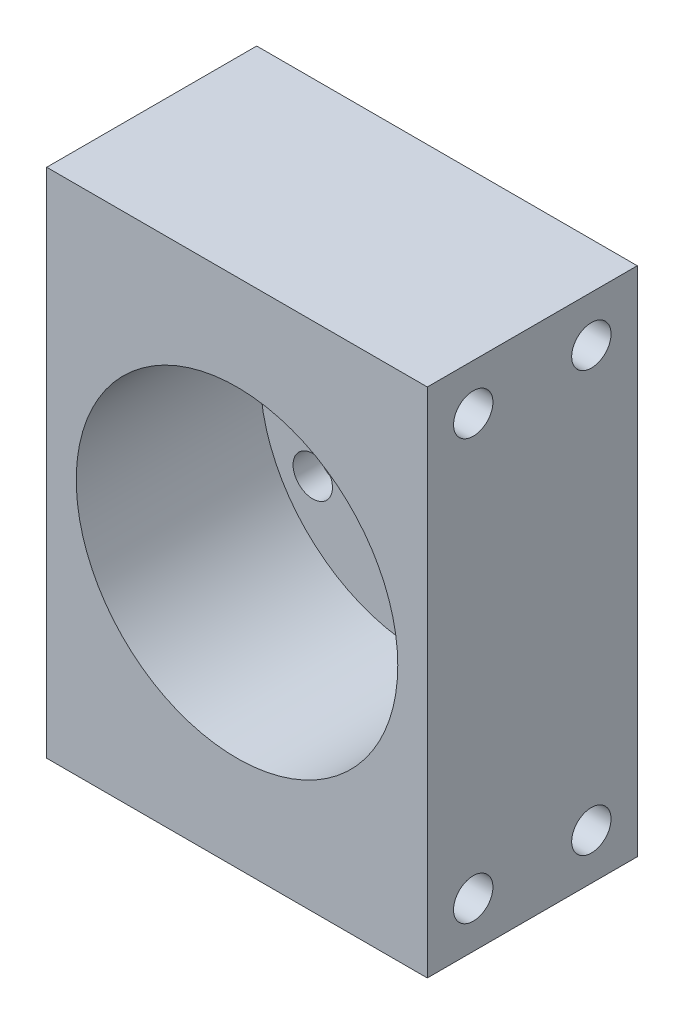
ISO-10303-21;
HEADER;
FILE_DESCRIPTION(('STEP AP214'),'2;1');
FILE_NAME('part.step','',(''),(''),'','','');
FILE_SCHEMA(('AUTOMOTIVE_DESIGN { 1 0 10303 214 1 1 1 1 }'));
ENDSEC;
DATA;
#1=APPLICATION_CONTEXT('core data for automotive mechanical design processes');
#2=APPLICATION_PROTOCOL_DEFINITION('international standard','automotive_design',2000,#1);
#3=PRODUCT_CONTEXT('',#1,'mechanical');
#4=PRODUCT('Part','Part','',(#3));
#5=PRODUCT_RELATED_PRODUCT_CATEGORY('part','',(#4));
#6=PRODUCT_DEFINITION_FORMATION('','',#4);
#7=PRODUCT_DEFINITION_CONTEXT('part definition',#1,'design');
#8=PRODUCT_DEFINITION('design','',#6,#7);
#9=PRODUCT_DEFINITION_SHAPE('','',#8);
#10=(LENGTH_UNIT() NAMED_UNIT(*) SI_UNIT(.MILLI.,.METRE.));
#11=(NAMED_UNIT(*) PLANE_ANGLE_UNIT() SI_UNIT($,.RADIAN.));
#12=(NAMED_UNIT(*) SI_UNIT($,.STERADIAN.) SOLID_ANGLE_UNIT());
#13=UNCERTAINTY_MEASURE_WITH_UNIT(LENGTH_MEASURE(1.E-05),#10,'distance_accuracy_value','');
#14=(GEOMETRIC_REPRESENTATION_CONTEXT(3) GLOBAL_UNCERTAINTY_ASSIGNED_CONTEXT((#13)) GLOBAL_UNIT_ASSIGNED_CONTEXT((#10,
#11,#12)) REPRESENTATION_CONTEXT('',''));
#15=CARTESIAN_POINT('',(0.,0.,0.));
#16=DIRECTION('',(0.,0.,1.));
#17=DIRECTION('',(1.,0.,0.));
#18=AXIS2_PLACEMENT_3D('',#15,#16,#17);
#19=CARTESIAN_POINT('',(27.8620253164557,-14.5,16.));
#20=DIRECTION('',(-1.,0.,0.));
#21=DIRECTION('',(0.,0.,1.));
#22=AXIS2_PLACEMENT_3D('',#19,#20,#21);
#23=PLANE('',#22);
#24=CARTESIAN_POINT('',(27.8620253164557,21.,12.5));
#25=DIRECTION('',(1.,0.,0.));
#26=DIRECTION('',(0.,0.,-1.));
#27=AXIS2_PLACEMENT_3D('',#24,#25,#26);
#28=CIRCLE('',#27,1.5);
#29=CARTESIAN_POINT('',(27.8620253164557,21.,11.));
#30=VERTEX_POINT('',#29);
#31=EDGE_CURVE('E178',#30,#30,#28,.T.);
#32=ORIENTED_EDGE('',*,*,#31,.F.);
#33=EDGE_LOOP('',(#32));
#34=FACE_BOUND('',#33,.T.);
#35=CARTESIAN_POINT('',(27.8620253164557,-11.,3.5));
#36=DIRECTION('',(1.,0.,0.));
#37=DIRECTION('',(0.,0.,-1.));
#38=AXIS2_PLACEMENT_3D('',#35,#36,#37);
#39=CIRCLE('',#38,1.5);
#40=CARTESIAN_POINT('',(27.8620253164557,-11.,2.));
#41=VERTEX_POINT('',#40);
#42=EDGE_CURVE('E182',#41,#41,#39,.T.);
#43=ORIENTED_EDGE('',*,*,#42,.F.);
#44=EDGE_LOOP('',(#43));
#45=FACE_BOUND('',#44,.T.);
#46=CARTESIAN_POINT('',(27.8620253164557,21.,3.5));
#47=DIRECTION('',(1.,0.,0.));
#48=DIRECTION('',(0.,0.,1.));
#49=AXIS2_PLACEMENT_3D('',#46,#47,#48);
#50=CIRCLE('',#49,1.49999999999999);
#51=CARTESIAN_POINT('',(27.8620253164557,21.,4.99999999999999));
#52=VERTEX_POINT('',#51);
#53=EDGE_CURVE('E186',#52,#52,#50,.T.);
#54=ORIENTED_EDGE('',*,*,#53,.F.);
#55=EDGE_LOOP('',(#54));
#56=FACE_BOUND('',#55,.T.);
#57=CARTESIAN_POINT('',(27.8620253164557,-11.,12.5));
#58=DIRECTION('',(1.,0.,0.));
#59=DIRECTION('',(0.,0.,1.));
#60=AXIS2_PLACEMENT_3D('',#57,#58,#59);
#61=CIRCLE('',#60,1.5);
#62=CARTESIAN_POINT('',(27.8620253164557,-11.,14.));
#63=VERTEX_POINT('',#62);
#64=EDGE_CURVE('E190',#63,#63,#61,.T.);
#65=ORIENTED_EDGE('',*,*,#64,.F.);
#66=EDGE_LOOP('',(#65));
#67=FACE_BOUND('',#66,.T.);
#68=DIRECTION('',(0.,1.,0.));
#69=VECTOR('',#68,1.);
#70=CARTESIAN_POINT('',(27.8620253164557,-14.5,0.));
#71=LINE('',#70,#69);
#72=CARTESIAN_POINT('',(27.8620253164557,-14.5,0.));
#73=VERTEX_POINT('',#72);
#74=CARTESIAN_POINT('',(27.8620253164557,24.5,0.));
#75=VERTEX_POINT('',#74);
#76=EDGE_CURVE('E107',#73,#75,#71,.T.);
#77=ORIENTED_EDGE('',*,*,#76,.T.);
#78=DIRECTION('',(0.,0.,-1.));
#79=VECTOR('',#78,1.);
#80=CARTESIAN_POINT('',(27.8620253164557,24.5,16.));
#81=LINE('',#80,#79);
#82=CARTESIAN_POINT('',(27.8620253164557,24.5,16.));
#83=VERTEX_POINT('',#82);
#84=EDGE_CURVE('E11',#83,#75,#81,.T.);
#85=ORIENTED_EDGE('',*,*,#84,.F.);
#86=DIRECTION('',(0.,1.,0.));
#87=VECTOR('',#86,1.);
#88=CARTESIAN_POINT('',(27.8620253164557,-14.5,16.));
#89=LINE('',#88,#87);
#90=CARTESIAN_POINT('',(27.8620253164557,-14.5,16.));
#91=VERTEX_POINT('',#90);
#92=EDGE_CURVE('E94',#91,#83,#89,.T.);
#93=ORIENTED_EDGE('',*,*,#92,.F.);
#94=DIRECTION('',(0.,0.,-1.));
#95=VECTOR('',#94,1.);
#96=CARTESIAN_POINT('',(27.8620253164557,-14.5,16.));
#97=LINE('',#96,#95);
#98=EDGE_CURVE('E103',#91,#73,#97,.T.);
#99=ORIENTED_EDGE('',*,*,#98,.T.);
#100=EDGE_LOOP('',(#77,#85,#93,#99));
#101=FACE_BOUND('',#100,.T.);
#102=ADVANCED_FACE('F41',(#34,#45,#56,#67,#101),#23,.F.);
#103=CARTESIAN_POINT('',(-1.13797468354431,24.5,16.));
#104=DIRECTION('',(0.,-1.,0.));
#105=DIRECTION('',(0.,0.,-1.));
#106=AXIS2_PLACEMENT_3D('',#103,#104,#105);
#107=PLANE('',#106);
#108=DIRECTION('',(-1.,0.,0.));
#109=VECTOR('',#108,1.);
#110=CARTESIAN_POINT('',(-1.13797468354431,24.5,0.));
#111=LINE('',#110,#109);
#112=CARTESIAN_POINT('',(-1.13797468354431,24.5,0.));
#113=VERTEX_POINT('',#112);
#114=EDGE_CURVE('E98',#75,#113,#111,.T.);
#115=ORIENTED_EDGE('',*,*,#114,.T.);
#116=DIRECTION('',(0.,0.,-1.));
#117=VECTOR('',#116,1.);
#118=CARTESIAN_POINT('',(-1.13797468354431,24.5,16.));
#119=LINE('',#118,#117);
#120=CARTESIAN_POINT('',(-1.13797468354431,24.5,16.));
#121=VERTEX_POINT('',#120);
#122=EDGE_CURVE('E50',#121,#113,#119,.T.);
#123=ORIENTED_EDGE('',*,*,#122,.F.);
#124=DIRECTION('',(-1.,0.,0.));
#125=VECTOR('',#124,1.);
#126=CARTESIAN_POINT('',(-1.13797468354431,24.5,16.));
#127=LINE('',#126,#125);
#128=EDGE_CURVE('E89',#83,#121,#127,.T.);
#129=ORIENTED_EDGE('',*,*,#128,.F.);
#130=ORIENTED_EDGE('',*,*,#84,.T.);
#131=EDGE_LOOP('',(#115,#123,#129,#130));
#132=FACE_BOUND('',#131,.T.);
#133=ADVANCED_FACE('F97',(#132),#107,.F.);
#134=CARTESIAN_POINT('',(-1.13797468354431,-14.5,16.));
#135=DIRECTION('',(1.,0.,0.));
#136=DIRECTION('',(0.,0.,-1.));
#137=AXIS2_PLACEMENT_3D('',#134,#135,#136);
#138=PLANE('',#137);
#139=CARTESIAN_POINT('',(-1.13797468354431,-11.,3.5));
#140=DIRECTION('',(-1.,0.,0.));
#141=DIRECTION('',(0.,0.,1.));
#142=AXIS2_PLACEMENT_3D('',#139,#140,#141);
#143=CIRCLE('',#142,1.5);
#144=CARTESIAN_POINT('',(-1.13797468354431,-11.,4.99999999999999));
#145=VERTEX_POINT('',#144);
#146=EDGE_CURVE('E216',#145,#145,#143,.T.);
#147=ORIENTED_EDGE('',*,*,#146,.F.);
#148=EDGE_LOOP('',(#147));
#149=FACE_BOUND('',#148,.T.);
#150=CARTESIAN_POINT('',(-1.13797468354431,21.,12.5));
#151=DIRECTION('',(-1.,0.,0.));
#152=DIRECTION('',(0.,0.,1.));
#153=AXIS2_PLACEMENT_3D('',#150,#151,#152);
#154=CIRCLE('',#153,1.5);
#155=CARTESIAN_POINT('',(-1.13797468354431,21.,14.));
#156=VERTEX_POINT('',#155);
#157=EDGE_CURVE('E210',#156,#156,#154,.T.);
#158=ORIENTED_EDGE('',*,*,#157,.F.);
#159=EDGE_LOOP('',(#158));
#160=FACE_BOUND('',#159,.T.);
#161=CARTESIAN_POINT('',(-1.13797468354431,-11.,12.5));
#162=DIRECTION('',(-1.,0.,0.));
#163=DIRECTION('',(0.,0.,-1.));
#164=AXIS2_PLACEMENT_3D('',#161,#162,#163);
#165=CIRCLE('',#164,1.5);
#166=CARTESIAN_POINT('',(-1.13797468354431,-11.,11.));
#167=VERTEX_POINT('',#166);
#168=EDGE_CURVE('E203',#167,#167,#165,.T.);
#169=ORIENTED_EDGE('',*,*,#168,.F.);
#170=EDGE_LOOP('',(#169));
#171=FACE_BOUND('',#170,.T.);
#172=CARTESIAN_POINT('',(-1.13797468354431,21.,3.5));
#173=DIRECTION('',(-1.,0.,0.));
#174=DIRECTION('',(0.,0.,-1.));
#175=AXIS2_PLACEMENT_3D('',#172,#173,#174);
#176=CIRCLE('',#175,1.5);
#177=CARTESIAN_POINT('',(-1.13797468354431,21.,2.));
#178=VERTEX_POINT('',#177);
#179=EDGE_CURVE('E206',#178,#178,#176,.T.);
#180=ORIENTED_EDGE('',*,*,#179,.F.);
#181=EDGE_LOOP('',(#180));
#182=FACE_BOUND('',#181,.T.);
#183=DIRECTION('',(0.,-1.,0.));
#184=VECTOR('',#183,1.);
#185=CARTESIAN_POINT('',(-1.13797468354431,-14.5,0.));
#186=LINE('',#185,#184);
#187=CARTESIAN_POINT('',(-1.13797468354431,-14.5,0.));
#188=VERTEX_POINT('',#187);
#189=EDGE_CURVE('E76',#113,#188,#186,.T.);
#190=ORIENTED_EDGE('',*,*,#189,.T.);
#191=DIRECTION('',(0.,0.,-1.));
#192=VECTOR('',#191,1.);
#193=CARTESIAN_POINT('',(-1.13797468354431,-14.5,16.));
#194=LINE('',#193,#192);
#195=CARTESIAN_POINT('',(-1.13797468354431,-14.5,16.));
#196=VERTEX_POINT('',#195);
#197=EDGE_CURVE('E99',#196,#188,#194,.T.);
#198=ORIENTED_EDGE('',*,*,#197,.F.);
#199=DIRECTION('',(0.,-1.,0.));
#200=VECTOR('',#199,1.);
#201=CARTESIAN_POINT('',(-1.13797468354431,-14.5,16.));
#202=LINE('',#201,#200);
#203=EDGE_CURVE('E92',#121,#196,#202,.T.);
#204=ORIENTED_EDGE('',*,*,#203,.F.);
#205=ORIENTED_EDGE('',*,*,#122,.T.);
#206=EDGE_LOOP('',(#190,#198,#204,#205));
#207=FACE_BOUND('',#206,.T.);
#208=ADVANCED_FACE('F101',(#149,#160,#171,#182,#207),#138,.F.);
#209=CARTESIAN_POINT('',(-1.13797468354431,-14.5,16.));
#210=DIRECTION('',(0.,1.,0.));
#211=DIRECTION('',(0.,0.,1.));
#212=AXIS2_PLACEMENT_3D('',#209,#210,#211);
#213=PLANE('',#212);
#214=DIRECTION('',(1.,0.,0.));
#215=VECTOR('',#214,1.);
#216=CARTESIAN_POINT('',(-1.13797468354431,-14.5,0.));
#217=LINE('',#216,#215);
#218=EDGE_CURVE('E82',#188,#73,#217,.T.);
#219=ORIENTED_EDGE('',*,*,#218,.T.);
#220=ORIENTED_EDGE('',*,*,#98,.F.);
#221=DIRECTION('',(1.,0.,0.));
#222=VECTOR('',#221,1.);
#223=CARTESIAN_POINT('',(-1.13797468354431,-14.5,16.));
#224=LINE('',#223,#222);
#225=EDGE_CURVE('E59',#196,#91,#224,.T.);
#226=ORIENTED_EDGE('',*,*,#225,.F.);
#227=ORIENTED_EDGE('',*,*,#197,.T.);
#228=EDGE_LOOP('',(#219,#220,#226,#227));
#229=FACE_BOUND('',#228,.T.);
#230=ADVANCED_FACE('F157',(#229),#213,.F.);
#231=CARTESIAN_POINT('',(0.,0.,16.));
#232=DIRECTION('',(0.,0.,-1.));
#233=DIRECTION('',(-1.,0.,0.));
#234=AXIS2_PLACEMENT_3D('',#231,#232,#233);
#235=PLANE('',#234);
#236=CARTESIAN_POINT('',(13.3620253164557,5.,16.));
#237=DIRECTION('',(0.,0.,1.));
#238=DIRECTION('',(1.,0.,0.));
#239=AXIS2_PLACEMENT_3D('',#236,#237,#238);
#240=CIRCLE('',#239,12.25);
#241=CARTESIAN_POINT('',(25.6120253164557,5.,16.));
#242=VERTEX_POINT('',#241);
#243=EDGE_CURVE('E119',#242,#242,#240,.T.);
#244=ORIENTED_EDGE('',*,*,#243,.F.);
#245=EDGE_LOOP('',(#244));
#246=FACE_BOUND('',#245,.T.);
#247=ORIENTED_EDGE('',*,*,#92,.T.);
#248=ORIENTED_EDGE('',*,*,#128,.T.);
#249=ORIENTED_EDGE('',*,*,#203,.T.);
#250=ORIENTED_EDGE('',*,*,#225,.T.);
#251=EDGE_LOOP('',(#247,#248,#249,#250));
#252=FACE_BOUND('',#251,.T.);
#253=ADVANCED_FACE('F90',(#246,#252),#235,.F.);
#254=CARTESIAN_POINT('',(0.,0.,0.));
#255=DIRECTION('',(0.,0.,-1.));
#256=DIRECTION('',(-1.,0.,0.));
#257=AXIS2_PLACEMENT_3D('',#254,#255,#256);
#258=PLANE('',#257);
#259=CARTESIAN_POINT('',(13.3620253164557,14.5,0.));
#260=DIRECTION('',(0.,0.,-1.));
#261=DIRECTION('',(-1.,0.,0.));
#262=AXIS2_PLACEMENT_3D('',#259,#260,#261);
#263=CIRCLE('',#262,1.5);
#264=CARTESIAN_POINT('',(11.8620253164557,14.5,0.));
#265=VERTEX_POINT('',#264);
#266=EDGE_CURVE('E125',#265,#265,#263,.T.);
#267=ORIENTED_EDGE('',*,*,#266,.F.);
#268=EDGE_LOOP('',(#267));
#269=FACE_BOUND('',#268,.T.);
#270=CARTESIAN_POINT('',(21.5892666524079,9.75,0.));
#271=DIRECTION('',(0.,0.,-1.));
#272=DIRECTION('',(-1.,0.,0.));
#273=AXIS2_PLACEMENT_3D('',#270,#271,#272);
#274=CIRCLE('',#273,1.5);
#275=CARTESIAN_POINT('',(20.0892666524079,9.75,0.));
#276=VERTEX_POINT('',#275);
#277=EDGE_CURVE('E224',#276,#276,#274,.T.);
#278=ORIENTED_EDGE('',*,*,#277,.F.);
#279=EDGE_LOOP('',(#278));
#280=FACE_BOUND('',#279,.T.);
#281=CARTESIAN_POINT('',(21.5892666524079,0.249999999999993,0.));
#282=DIRECTION('',(0.,0.,-1.));
#283=DIRECTION('',(-1.,0.,0.));
#284=AXIS2_PLACEMENT_3D('',#281,#282,#283);
#285=CIRCLE('',#284,1.5);
#286=CARTESIAN_POINT('',(20.0892666524079,0.249999999999993,0.));
#287=VERTEX_POINT('',#286);
#288=EDGE_CURVE('E146',#287,#287,#285,.T.);
#289=ORIENTED_EDGE('',*,*,#288,.F.);
#290=EDGE_LOOP('',(#289));
#291=FACE_BOUND('',#290,.T.);
#292=CARTESIAN_POINT('',(13.3620253164557,-4.5,0.));
#293=DIRECTION('',(0.,0.,-1.));
#294=DIRECTION('',(-1.,0.,0.));
#295=AXIS2_PLACEMENT_3D('',#292,#293,#294);
#296=CIRCLE('',#295,1.5);
#297=CARTESIAN_POINT('',(11.8620253164557,-4.5,0.));
#298=VERTEX_POINT('',#297);
#299=EDGE_CURVE('E236',#298,#298,#296,.T.);
#300=ORIENTED_EDGE('',*,*,#299,.F.);
#301=EDGE_LOOP('',(#300));
#302=FACE_BOUND('',#301,.T.);
#303=CARTESIAN_POINT('',(5.13478398050352,0.25,0.));
#304=DIRECTION('',(0.,0.,-1.));
#305=DIRECTION('',(-1.,0.,0.));
#306=AXIS2_PLACEMENT_3D('',#303,#304,#305);
#307=CIRCLE('',#306,1.5);
#308=CARTESIAN_POINT('',(3.63478398050352,0.25,0.));
#309=VERTEX_POINT('',#308);
#310=EDGE_CURVE('E234',#309,#309,#307,.T.);
#311=ORIENTED_EDGE('',*,*,#310,.F.);
#312=EDGE_LOOP('',(#311));
#313=FACE_BOUND('',#312,.T.);
#314=CARTESIAN_POINT('',(5.13478398050352,9.75,0.));
#315=DIRECTION('',(0.,0.,-1.));
#316=DIRECTION('',(-1.,0.,0.));
#317=AXIS2_PLACEMENT_3D('',#314,#315,#316);
#318=CIRCLE('',#317,1.5);
#319=CARTESIAN_POINT('',(3.63478398050352,9.75,0.));
#320=VERTEX_POINT('',#319);
#321=EDGE_CURVE('E229',#320,#320,#318,.T.);
#322=ORIENTED_EDGE('',*,*,#321,.F.);
#323=EDGE_LOOP('',(#322));
#324=FACE_BOUND('',#323,.T.);
#325=CARTESIAN_POINT('',(13.3620253164557,5.,0.));
#326=DIRECTION('',(0.,0.,-1.));
#327=DIRECTION('',(-1.,0.,0.));
#328=AXIS2_PLACEMENT_3D('',#325,#326,#327);
#329=CIRCLE('',#328,6.75);
#330=CARTESIAN_POINT('',(6.61202531645569,5.,0.));
#331=VERTEX_POINT('',#330);
#332=EDGE_CURVE('E120',#331,#331,#329,.T.);
#333=ORIENTED_EDGE('',*,*,#332,.F.);
#334=EDGE_LOOP('',(#333));
#335=FACE_BOUND('',#334,.T.);
#336=ORIENTED_EDGE('',*,*,#76,.F.);
#337=ORIENTED_EDGE('',*,*,#218,.F.);
#338=ORIENTED_EDGE('',*,*,#189,.F.);
#339=ORIENTED_EDGE('',*,*,#114,.F.);
#340=EDGE_LOOP('',(#336,#337,#338,#339));
#341=FACE_BOUND('',#340,.T.);
#342=ADVANCED_FACE('F156',(#269,#280,#291,#302,#313,#324,#335,#341),#258,.T.);
#343=CARTESIAN_POINT('',(13.3620253164557,5.,2.));
#344=DIRECTION('',(0.,0.,1.));
#345=DIRECTION('',(1.,0.,0.));
#346=AXIS2_PLACEMENT_3D('',#343,#344,#345);
#347=CYLINDRICAL_SURFACE('',#346,12.25);
#348=CARTESIAN_POINT('',(13.3620253164557,5.,2.));
#349=DIRECTION('',(0.,0.,1.));
#350=DIRECTION('',(1.,0.,0.));
#351=AXIS2_PLACEMENT_3D('',#348,#349,#350);
#352=CIRCLE('',#351,12.25);
#353=CARTESIAN_POINT('',(25.6120253164557,5.,2.));
#354=VERTEX_POINT('',#353);
#355=EDGE_CURVE('E110',#354,#354,#352,.T.);
#356=ORIENTED_EDGE('',*,*,#355,.F.);
#357=EDGE_LOOP('',(#356));
#358=FACE_BOUND('',#357,.T.);
#359=ORIENTED_EDGE('',*,*,#243,.T.);
#360=EDGE_LOOP('',(#359));
#361=FACE_BOUND('',#360,.T.);
#362=ADVANCED_FACE('F153',(#358,#361),#347,.F.);
#363=CARTESIAN_POINT('',(13.3620253164557,5.,2.));
#364=DIRECTION('',(0.,0.,1.));
#365=DIRECTION('',(1.,0.,0.));
#366=AXIS2_PLACEMENT_3D('',#363,#364,#365);
#367=PLANE('',#366);
#368=CARTESIAN_POINT('',(13.3620253164557,14.5,2.));
#369=DIRECTION('',(0.,0.,1.));
#370=DIRECTION('',(1.,0.,0.));
#371=AXIS2_PLACEMENT_3D('',#368,#369,#370);
#372=CIRCLE('',#371,1.5);
#373=CARTESIAN_POINT('',(14.8620253164557,14.5,2.));
#374=VERTEX_POINT('',#373);
#375=EDGE_CURVE('E44',#374,#374,#372,.T.);
#376=ORIENTED_EDGE('',*,*,#375,.F.);
#377=EDGE_LOOP('',(#376));
#378=FACE_BOUND('',#377,.T.);
#379=CARTESIAN_POINT('',(21.5892666524079,9.75,2.));
#380=DIRECTION('',(0.,0.,1.));
#381=DIRECTION('',(1.,0.,0.));
#382=AXIS2_PLACEMENT_3D('',#379,#380,#381);
#383=CIRCLE('',#382,1.5);
#384=CARTESIAN_POINT('',(23.0892666524079,9.75,2.));
#385=VERTEX_POINT('',#384);
#386=EDGE_CURVE('E133',#385,#385,#383,.T.);
#387=ORIENTED_EDGE('',*,*,#386,.F.);
#388=EDGE_LOOP('',(#387));
#389=FACE_BOUND('',#388,.T.);
#390=CARTESIAN_POINT('',(21.5892666524079,0.249999999999993,2.));
#391=DIRECTION('',(0.,0.,1.));
#392=DIRECTION('',(1.,0.,0.));
#393=AXIS2_PLACEMENT_3D('',#390,#391,#392);
#394=CIRCLE('',#393,1.5);
#395=CARTESIAN_POINT('',(23.0892666524079,0.249999999999993,2.));
#396=VERTEX_POINT('',#395);
#397=EDGE_CURVE('E131',#396,#396,#394,.T.);
#398=ORIENTED_EDGE('',*,*,#397,.F.);
#399=EDGE_LOOP('',(#398));
#400=FACE_BOUND('',#399,.T.);
#401=CARTESIAN_POINT('',(13.3620253164557,-4.5,2.));
#402=DIRECTION('',(0.,0.,1.));
#403=DIRECTION('',(1.,0.,0.));
#404=AXIS2_PLACEMENT_3D('',#401,#402,#403);
#405=CIRCLE('',#404,1.5);
#406=CARTESIAN_POINT('',(14.8620253164557,-4.5,2.));
#407=VERTEX_POINT('',#406);
#408=EDGE_CURVE('E128',#407,#407,#405,.T.);
#409=ORIENTED_EDGE('',*,*,#408,.F.);
#410=EDGE_LOOP('',(#409));
#411=FACE_BOUND('',#410,.T.);
#412=CARTESIAN_POINT('',(5.13478398050352,0.25,2.));
#413=DIRECTION('',(0.,0.,1.));
#414=DIRECTION('',(1.,0.,0.));
#415=AXIS2_PLACEMENT_3D('',#412,#413,#414);
#416=CIRCLE('',#415,1.5);
#417=CARTESIAN_POINT('',(6.63478398050352,0.25,2.));
#418=VERTEX_POINT('',#417);
#419=EDGE_CURVE('E124',#418,#418,#416,.T.);
#420=ORIENTED_EDGE('',*,*,#419,.F.);
#421=EDGE_LOOP('',(#420));
#422=FACE_BOUND('',#421,.T.);
#423=CARTESIAN_POINT('',(5.13478398050352,9.75,2.));
#424=DIRECTION('',(0.,0.,1.));
#425=DIRECTION('',(1.,0.,0.));
#426=AXIS2_PLACEMENT_3D('',#423,#424,#425);
#427=CIRCLE('',#426,1.5);
#428=CARTESIAN_POINT('',(6.63478398050352,9.75,2.));
#429=VERTEX_POINT('',#428);
#430=EDGE_CURVE('E121',#429,#429,#427,.T.);
#431=ORIENTED_EDGE('',*,*,#430,.F.);
#432=EDGE_LOOP('',(#431));
#433=FACE_BOUND('',#432,.T.);
#434=CARTESIAN_POINT('',(13.3620253164557,5.,2.));
#435=DIRECTION('',(0.,0.,1.));
#436=DIRECTION('',(1.,0.,0.));
#437=AXIS2_PLACEMENT_3D('',#434,#435,#436);
#438=CIRCLE('',#437,6.75);
#439=CARTESIAN_POINT('',(20.1120253164557,5.,2.));
#440=VERTEX_POINT('',#439);
#441=EDGE_CURVE('E116',#440,#440,#438,.T.);
#442=ORIENTED_EDGE('',*,*,#441,.F.);
#443=EDGE_LOOP('',(#442));
#444=FACE_BOUND('',#443,.T.);
#445=ORIENTED_EDGE('',*,*,#355,.T.);
#446=EDGE_LOOP('',(#445));
#447=FACE_BOUND('',#446,.T.);
#448=ADVANCED_FACE('F266',(#378,#389,#400,#411,#422,#433,#444,#447),#367,.T.);
#449=CARTESIAN_POINT('',(13.3620253164557,5.,14.));
#450=DIRECTION('',(0.,0.,-1.));
#451=DIRECTION('',(-1.,0.,0.));
#452=AXIS2_PLACEMENT_3D('',#449,#450,#451);
#453=CYLINDRICAL_SURFACE('',#452,6.75);
#454=ORIENTED_EDGE('',*,*,#441,.T.);
#455=EDGE_LOOP('',(#454));
#456=FACE_BOUND('',#455,.T.);
#457=ORIENTED_EDGE('',*,*,#332,.T.);
#458=EDGE_LOOP('',(#457));
#459=FACE_BOUND('',#458,.T.);
#460=ADVANCED_FACE('F255',(#456,#459),#453,.F.);
#461=CARTESIAN_POINT('',(5.13478398050352,9.75,14.));
#462=DIRECTION('',(0.,0.,-1.));
#463=DIRECTION('',(-1.,0.,0.));
#464=AXIS2_PLACEMENT_3D('',#461,#462,#463);
#465=CYLINDRICAL_SURFACE('',#464,1.5);
#466=ORIENTED_EDGE('',*,*,#430,.T.);
#467=EDGE_LOOP('',(#466));
#468=FACE_BOUND('',#467,.T.);
#469=ORIENTED_EDGE('',*,*,#321,.T.);
#470=EDGE_LOOP('',(#469));
#471=FACE_BOUND('',#470,.T.);
#472=ADVANCED_FACE('F252',(#468,#471),#465,.F.);
#473=CARTESIAN_POINT('',(5.13478398050352,0.25,14.));
#474=DIRECTION('',(0.,0.,-1.));
#475=DIRECTION('',(-1.,0.,0.));
#476=AXIS2_PLACEMENT_3D('',#473,#474,#475);
#477=CYLINDRICAL_SURFACE('',#476,1.5);
#478=ORIENTED_EDGE('',*,*,#419,.T.);
#479=EDGE_LOOP('',(#478));
#480=FACE_BOUND('',#479,.T.);
#481=ORIENTED_EDGE('',*,*,#310,.T.);
#482=EDGE_LOOP('',(#481));
#483=FACE_BOUND('',#482,.T.);
#484=ADVANCED_FACE('F254',(#480,#483),#477,.F.);
#485=CARTESIAN_POINT('',(13.3620253164557,-4.5,14.));
#486=DIRECTION('',(0.,0.,-1.));
#487=DIRECTION('',(-1.,0.,0.));
#488=AXIS2_PLACEMENT_3D('',#485,#486,#487);
#489=CYLINDRICAL_SURFACE('',#488,1.5);
#490=ORIENTED_EDGE('',*,*,#408,.T.);
#491=EDGE_LOOP('',(#490));
#492=FACE_BOUND('',#491,.T.);
#493=ORIENTED_EDGE('',*,*,#299,.T.);
#494=EDGE_LOOP('',(#493));
#495=FACE_BOUND('',#494,.T.);
#496=ADVANCED_FACE('F262',(#492,#495),#489,.F.);
#497=CARTESIAN_POINT('',(21.5892666524079,0.249999999999993,14.));
#498=DIRECTION('',(0.,0.,-1.));
#499=DIRECTION('',(-1.,0.,0.));
#500=AXIS2_PLACEMENT_3D('',#497,#498,#499);
#501=CYLINDRICAL_SURFACE('',#500,1.5);
#502=ORIENTED_EDGE('',*,*,#397,.T.);
#503=EDGE_LOOP('',(#502));
#504=FACE_BOUND('',#503,.T.);
#505=ORIENTED_EDGE('',*,*,#288,.T.);
#506=EDGE_LOOP('',(#505));
#507=FACE_BOUND('',#506,.T.);
#508=ADVANCED_FACE('F243',(#504,#507),#501,.F.);
#509=CARTESIAN_POINT('',(21.5892666524079,9.75,14.));
#510=DIRECTION('',(0.,0.,-1.));
#511=DIRECTION('',(-1.,0.,0.));
#512=AXIS2_PLACEMENT_3D('',#509,#510,#511);
#513=CYLINDRICAL_SURFACE('',#512,1.5);
#514=ORIENTED_EDGE('',*,*,#386,.T.);
#515=EDGE_LOOP('',(#514));
#516=FACE_BOUND('',#515,.T.);
#517=ORIENTED_EDGE('',*,*,#277,.T.);
#518=EDGE_LOOP('',(#517));
#519=FACE_BOUND('',#518,.T.);
#520=ADVANCED_FACE('F270',(#516,#519),#513,.F.);
#521=CARTESIAN_POINT('',(13.3620253164557,14.5,14.));
#522=DIRECTION('',(0.,0.,-1.));
#523=DIRECTION('',(-1.,0.,0.));
#524=AXIS2_PLACEMENT_3D('',#521,#522,#523);
#525=CYLINDRICAL_SURFACE('',#524,1.5);
#526=ORIENTED_EDGE('',*,*,#375,.T.);
#527=EDGE_LOOP('',(#526));
#528=FACE_BOUND('',#527,.T.);
#529=ORIENTED_EDGE('',*,*,#266,.T.);
#530=EDGE_LOOP('',(#529));
#531=FACE_BOUND('',#530,.T.);
#532=ADVANCED_FACE('F330',(#528,#531),#525,.F.);
#533=CARTESIAN_POINT('',(8.86202531645569,21.,3.5));
#534=DIRECTION('',(-1.,0.,0.));
#535=DIRECTION('',(0.,0.,1.));
#536=AXIS2_PLACEMENT_3D('',#533,#534,#535);
#537=CYLINDRICAL_SURFACE('',#536,1.5);
#538=CARTESIAN_POINT('',(8.86202531645569,21.,3.5));
#539=DIRECTION('',(-1.,0.,0.));
#540=DIRECTION('',(0.,0.,-1.));
#541=AXIS2_PLACEMENT_3D('',#538,#539,#540);
#542=CIRCLE('',#541,1.5);
#543=CARTESIAN_POINT('',(8.86202531645569,21.,2.));
#544=VERTEX_POINT('',#543);
#545=EDGE_CURVE('E221',#544,#544,#542,.T.);
#546=ORIENTED_EDGE('',*,*,#545,.F.);
#547=EDGE_LOOP('',(#546));
#548=FACE_BOUND('',#547,.T.);
#549=ORIENTED_EDGE('',*,*,#179,.T.);
#550=EDGE_LOOP('',(#549));
#551=FACE_BOUND('',#550,.T.);
#552=ADVANCED_FACE('F337',(#548,#551),#537,.F.);
#553=CARTESIAN_POINT('',(8.86202531645569,21.,3.5));
#554=DIRECTION('',(1.,0.,0.));
#555=DIRECTION('',(0.,0.,-1.));
#556=AXIS2_PLACEMENT_3D('',#553,#554,#555);
#557=PLANE('',#556);
#558=ORIENTED_EDGE('',*,*,#545,.T.);
#559=EDGE_LOOP('',(#558));
#560=FACE_BOUND('',#559,.T.);
#561=ADVANCED_FACE('F344',(#560),#557,.F.);
#562=CARTESIAN_POINT('',(8.86202531645569,-11.,12.5));
#563=DIRECTION('',(-1.,0.,0.));
#564=DIRECTION('',(0.,0.,1.));
#565=AXIS2_PLACEMENT_3D('',#562,#563,#564);
#566=CYLINDRICAL_SURFACE('',#565,1.5);
#567=CARTESIAN_POINT('',(8.86202531645569,-11.,12.5));
#568=DIRECTION('',(-1.,0.,0.));
#569=DIRECTION('',(0.,0.,-1.));
#570=AXIS2_PLACEMENT_3D('',#567,#568,#569);
#571=CIRCLE('',#570,1.5);
#572=CARTESIAN_POINT('',(8.86202531645569,-11.,11.));
#573=VERTEX_POINT('',#572);
#574=EDGE_CURVE('E207',#573,#573,#571,.T.);
#575=ORIENTED_EDGE('',*,*,#574,.F.);
#576=EDGE_LOOP('',(#575));
#577=FACE_BOUND('',#576,.T.);
#578=ORIENTED_EDGE('',*,*,#168,.T.);
#579=EDGE_LOOP('',(#578));
#580=FACE_BOUND('',#579,.T.);
#581=ADVANCED_FACE('F353',(#577,#580),#566,.F.);
#582=CARTESIAN_POINT('',(8.86202531645569,-11.,12.5));
#583=DIRECTION('',(1.,0.,0.));
#584=DIRECTION('',(0.,0.,-1.));
#585=AXIS2_PLACEMENT_3D('',#582,#583,#584);
#586=PLANE('',#585);
#587=ORIENTED_EDGE('',*,*,#574,.T.);
#588=EDGE_LOOP('',(#587));
#589=FACE_BOUND('',#588,.T.);
#590=ADVANCED_FACE('F362',(#589),#586,.F.);
#591=CARTESIAN_POINT('',(8.86202531645569,21.,12.5));
#592=DIRECTION('',(-1.,0.,0.));
#593=DIRECTION('',(0.,0.,1.));
#594=AXIS2_PLACEMENT_3D('',#591,#592,#593);
#595=CYLINDRICAL_SURFACE('',#594,1.5);
#596=CARTESIAN_POINT('',(8.86202531645569,21.,12.5));
#597=DIRECTION('',(-1.,0.,0.));
#598=DIRECTION('',(0.,0.,1.));
#599=AXIS2_PLACEMENT_3D('',#596,#597,#598);
#600=CIRCLE('',#599,1.5);
#601=CARTESIAN_POINT('',(8.86202531645569,21.,14.));
#602=VERTEX_POINT('',#601);
#603=EDGE_CURVE('E213',#602,#602,#600,.T.);
#604=ORIENTED_EDGE('',*,*,#603,.F.);
#605=EDGE_LOOP('',(#604));
#606=FACE_BOUND('',#605,.T.);
#607=ORIENTED_EDGE('',*,*,#157,.T.);
#608=EDGE_LOOP('',(#607));
#609=FACE_BOUND('',#608,.T.);
#610=ADVANCED_FACE('F371',(#606,#609),#595,.F.);
#611=CARTESIAN_POINT('',(8.86202531645569,21.,12.5));
#612=DIRECTION('',(-1.,0.,0.));
#613=DIRECTION('',(0.,0.,1.));
#614=AXIS2_PLACEMENT_3D('',#611,#612,#613);
#615=PLANE('',#614);
#616=ORIENTED_EDGE('',*,*,#603,.T.);
#617=EDGE_LOOP('',(#616));
#618=FACE_BOUND('',#617,.T.);
#619=ADVANCED_FACE('F380',(#618),#615,.T.);
#620=CARTESIAN_POINT('',(8.86202531645569,-11.,3.5));
#621=DIRECTION('',(-1.,0.,0.));
#622=DIRECTION('',(0.,0.,1.));
#623=AXIS2_PLACEMENT_3D('',#620,#621,#622);
#624=CYLINDRICAL_SURFACE('',#623,1.5);
#625=CARTESIAN_POINT('',(8.86202531645569,-11.,3.5));
#626=DIRECTION('',(-1.,0.,0.));
#627=DIRECTION('',(0.,0.,1.));
#628=AXIS2_PLACEMENT_3D('',#625,#626,#627);
#629=CIRCLE('',#628,1.5);
#630=CARTESIAN_POINT('',(8.86202531645569,-11.,4.99999999999999));
#631=VERTEX_POINT('',#630);
#632=EDGE_CURVE('E197',#631,#631,#629,.T.);
#633=ORIENTED_EDGE('',*,*,#632,.F.);
#634=EDGE_LOOP('',(#633));
#635=FACE_BOUND('',#634,.T.);
#636=ORIENTED_EDGE('',*,*,#146,.T.);
#637=EDGE_LOOP('',(#636));
#638=FACE_BOUND('',#637,.T.);
#639=ADVANCED_FACE('F389',(#635,#638),#624,.F.);
#640=CARTESIAN_POINT('',(8.86202531645569,-11.,3.5));
#641=DIRECTION('',(-1.,0.,0.));
#642=DIRECTION('',(0.,0.,1.));
#643=AXIS2_PLACEMENT_3D('',#640,#641,#642);
#644=PLANE('',#643);
#645=ORIENTED_EDGE('',*,*,#632,.T.);
#646=EDGE_LOOP('',(#645));
#647=FACE_BOUND('',#646,.T.);
#648=ADVANCED_FACE('F398',(#647),#644,.T.);
#649=CARTESIAN_POINT('',(17.8620253164557,-11.,12.5));
#650=DIRECTION('',(1.,0.,0.));
#651=DIRECTION('',(0.,0.,-1.));
#652=AXIS2_PLACEMENT_3D('',#649,#650,#651);
#653=CYLINDRICAL_SURFACE('',#652,1.5);
#654=CARTESIAN_POINT('',(17.8620253164557,-11.,12.5));
#655=DIRECTION('',(1.,0.,0.));
#656=DIRECTION('',(0.,0.,1.));
#657=AXIS2_PLACEMENT_3D('',#654,#655,#656);
#658=CIRCLE('',#657,1.5);
#659=CARTESIAN_POINT('',(17.8620253164557,-11.,14.));
#660=VERTEX_POINT('',#659);
#661=EDGE_CURVE('E194',#660,#660,#658,.T.);
#662=ORIENTED_EDGE('',*,*,#661,.F.);
#663=EDGE_LOOP('',(#662));
#664=FACE_BOUND('',#663,.T.);
#665=ORIENTED_EDGE('',*,*,#64,.T.);
#666=EDGE_LOOP('',(#665));
#667=FACE_BOUND('',#666,.T.);
#668=ADVANCED_FACE('F406',(#664,#667),#653,.F.);
#669=CARTESIAN_POINT('',(17.8620253164557,-11.,12.5));
#670=DIRECTION('',(-1.,0.,0.));
#671=DIRECTION('',(0.,0.,1.));
#672=AXIS2_PLACEMENT_3D('',#669,#670,#671);
#673=PLANE('',#672);
#674=ORIENTED_EDGE('',*,*,#661,.T.);
#675=EDGE_LOOP('',(#674));
#676=FACE_BOUND('',#675,.T.);
#677=ADVANCED_FACE('F414',(#676),#673,.F.);
#678=CARTESIAN_POINT('',(17.8620253164557,21.,3.5));
#679=DIRECTION('',(1.,0.,0.));
#680=DIRECTION('',(0.,0.,-1.));
#681=AXIS2_PLACEMENT_3D('',#678,#679,#680);
#682=CYLINDRICAL_SURFACE('',#681,1.49999999999999);
#683=CARTESIAN_POINT('',(17.8620253164557,21.,3.5));
#684=DIRECTION('',(1.,0.,0.));
#685=DIRECTION('',(0.,0.,1.));
#686=AXIS2_PLACEMENT_3D('',#683,#684,#685);
#687=CIRCLE('',#686,1.49999999999999);
#688=CARTESIAN_POINT('',(17.8620253164557,21.,4.99999999999999));
#689=VERTEX_POINT('',#688);
#690=EDGE_CURVE('E199',#689,#689,#687,.T.);
#691=ORIENTED_EDGE('',*,*,#690,.F.);
#692=EDGE_LOOP('',(#691));
#693=FACE_BOUND('',#692,.T.);
#694=ORIENTED_EDGE('',*,*,#53,.T.);
#695=EDGE_LOOP('',(#694));
#696=FACE_BOUND('',#695,.T.);
#697=ADVANCED_FACE('F423',(#693,#696),#682,.F.);
#698=CARTESIAN_POINT('',(17.8620253164557,21.,3.5));
#699=DIRECTION('',(-1.,0.,0.));
#700=DIRECTION('',(0.,0.,1.));
#701=AXIS2_PLACEMENT_3D('',#698,#699,#700);
#702=PLANE('',#701);
#703=ORIENTED_EDGE('',*,*,#690,.T.);
#704=EDGE_LOOP('',(#703));
#705=FACE_BOUND('',#704,.T.);
#706=ADVANCED_FACE('F432',(#705),#702,.F.);
#707=CARTESIAN_POINT('',(17.8620253164557,-11.,3.5));
#708=DIRECTION('',(1.,0.,0.));
#709=DIRECTION('',(0.,0.,-1.));
#710=AXIS2_PLACEMENT_3D('',#707,#708,#709);
#711=CYLINDRICAL_SURFACE('',#710,1.5);
#712=CARTESIAN_POINT('',(17.8620253164557,-11.,3.5));
#713=DIRECTION('',(1.,0.,0.));
#714=DIRECTION('',(0.,0.,-1.));
#715=AXIS2_PLACEMENT_3D('',#712,#713,#714);
#716=CIRCLE('',#715,1.5);
#717=CARTESIAN_POINT('',(17.8620253164557,-11.,2.));
#718=VERTEX_POINT('',#717);
#719=EDGE_CURVE('E491',#718,#718,#716,.T.);
#720=ORIENTED_EDGE('',*,*,#719,.F.);
#721=EDGE_LOOP('',(#720));
#722=FACE_BOUND('',#721,.T.);
#723=ORIENTED_EDGE('',*,*,#42,.T.);
#724=EDGE_LOOP('',(#723));
#725=FACE_BOUND('',#724,.T.);
#726=ADVANCED_FACE('F441',(#722,#725),#711,.F.);
#727=CARTESIAN_POINT('',(17.8620253164557,-11.,3.5));
#728=DIRECTION('',(1.,0.,0.));
#729=DIRECTION('',(0.,0.,-1.));
#730=AXIS2_PLACEMENT_3D('',#727,#728,#729);
#731=PLANE('',#730);
#732=ORIENTED_EDGE('',*,*,#719,.T.);
#733=EDGE_LOOP('',(#732));
#734=FACE_BOUND('',#733,.T.);
#735=ADVANCED_FACE('F450',(#734),#731,.T.);
#736=CARTESIAN_POINT('',(17.8620253164557,21.,12.5));
#737=DIRECTION('',(1.,0.,0.));
#738=DIRECTION('',(0.,0.,-1.));
#739=AXIS2_PLACEMENT_3D('',#736,#737,#738);
#740=CYLINDRICAL_SURFACE('',#739,1.5);
#741=CARTESIAN_POINT('',(17.8620253164557,21.,12.5));
#742=DIRECTION('',(1.,0.,0.));
#743=DIRECTION('',(0.,0.,-1.));
#744=AXIS2_PLACEMENT_3D('',#741,#742,#743);
#745=CIRCLE('',#744,1.5);
#746=CARTESIAN_POINT('',(17.8620253164557,21.,11.));
#747=VERTEX_POINT('',#746);
#748=EDGE_CURVE('E490',#747,#747,#745,.T.);
#749=ORIENTED_EDGE('',*,*,#748,.F.);
#750=EDGE_LOOP('',(#749));
#751=FACE_BOUND('',#750,.T.);
#752=ORIENTED_EDGE('',*,*,#31,.T.);
#753=EDGE_LOOP('',(#752));
#754=FACE_BOUND('',#753,.T.);
#755=ADVANCED_FACE('F459',(#751,#754),#740,.F.);
#756=CARTESIAN_POINT('',(17.8620253164557,21.,12.5));
#757=DIRECTION('',(1.,0.,0.));
#758=DIRECTION('',(0.,0.,-1.));
#759=AXIS2_PLACEMENT_3D('',#756,#757,#758);
#760=PLANE('',#759);
#761=ORIENTED_EDGE('',*,*,#748,.T.);
#762=EDGE_LOOP('',(#761));
#763=FACE_BOUND('',#762,.T.);
#764=ADVANCED_FACE('F468',(#763),#760,.T.);
#765=CLOSED_SHELL('',(#102,#133,#208,#230,#253,#342,#362,#448,#460,#472,#484,#496,#508,#520,
#532,#552,#561,#581,#590,#610,#619,#639,#648,#668,#677,#697,#706,#726,#735,#755,#764));
#766=MANIFOLD_SOLID_BREP('B2',#765);
#767=ADVANCED_BREP_SHAPE_REPRESENTATION('',(#18,#766),#14);
#768=SHAPE_DEFINITION_REPRESENTATION(#9,#767);
ENDSEC;
END-ISO-10303-21;
